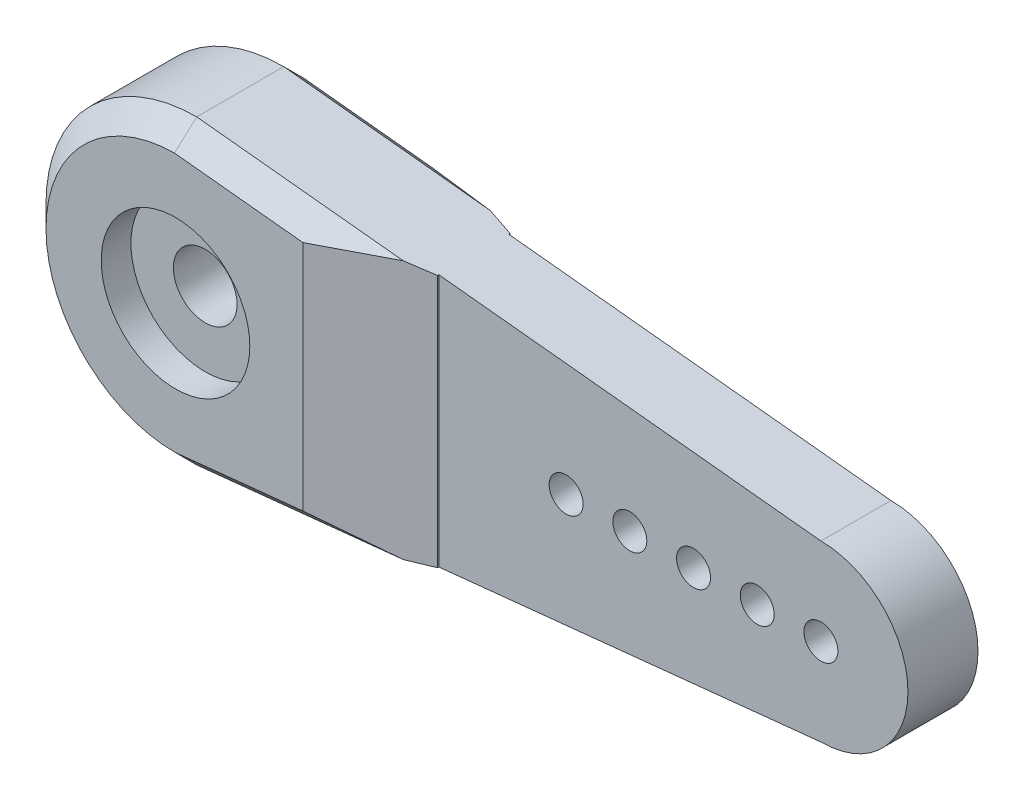
ISO-10303-21;
HEADER;
FILE_DESCRIPTION(('STEP AP214'),'2;1');
FILE_NAME('part.step','',(''),(''),'','','');
FILE_SCHEMA(('AUTOMOTIVE_DESIGN { 1 0 10303 214 1 1 1 1 }'));
ENDSEC;
DATA;
#1=APPLICATION_CONTEXT('core data for automotive mechanical design processes');
#2=APPLICATION_PROTOCOL_DEFINITION('international standard','automotive_design',2000,#1);
#3=PRODUCT_CONTEXT('',#1,'mechanical');
#4=PRODUCT('Part','Part','',(#3));
#5=PRODUCT_RELATED_PRODUCT_CATEGORY('part','',(#4));
#6=PRODUCT_DEFINITION_FORMATION('','',#4);
#7=PRODUCT_DEFINITION_CONTEXT('part definition',#1,'design');
#8=PRODUCT_DEFINITION('design','',#6,#7);
#9=PRODUCT_DEFINITION_SHAPE('','',#8);
#10=(LENGTH_UNIT() NAMED_UNIT(*) SI_UNIT(.MILLI.,.METRE.));
#11=(NAMED_UNIT(*) PLANE_ANGLE_UNIT() SI_UNIT($,.RADIAN.));
#12=(NAMED_UNIT(*) SI_UNIT($,.STERADIAN.) SOLID_ANGLE_UNIT());
#13=UNCERTAINTY_MEASURE_WITH_UNIT(LENGTH_MEASURE(1.E-05),#10,'distance_accuracy_value','');
#14=(GEOMETRIC_REPRESENTATION_CONTEXT(3) GLOBAL_UNCERTAINTY_ASSIGNED_CONTEXT((#13)) GLOBAL_UNIT_ASSIGNED_CONTEXT((#10,
#11,#12)) REPRESENTATION_CONTEXT('',''));
#15=CARTESIAN_POINT('',(0.,0.,0.));
#16=DIRECTION('',(0.,0.,1.));
#17=DIRECTION('',(1.,0.,0.));
#18=AXIS2_PLACEMENT_3D('',#15,#16,#17);
#19=CARTESIAN_POINT('',(0.,0.,3.3));
#20=DIRECTION('',(0.,0.,1.));
#21=DIRECTION('',(1.,0.,0.));
#22=AXIS2_PLACEMENT_3D('',#19,#20,#21);
#23=PLANE('',#22);
#24=DIRECTION('',(0.,1.,0.));
#25=VECTOR('',#24,1.);
#26=CARTESIAN_POINT('',(11.,0.,3.3));
#27=LINE('',#26,#25);
#28=CARTESIAN_POINT('',(11.,-5.96206896551724,3.3));
#29=VERTEX_POINT('',#28);
#30=CARTESIAN_POINT('',(11.,5.96206896551724,3.3));
#31=VERTEX_POINT('',#30);
#32=EDGE_CURVE('E162',#29,#31,#27,.T.);
#33=ORIENTED_EDGE('',*,*,#32,.F.);
#34=DIRECTION('',(0.994691793826551,0.102899151085505,0.));
#35=VECTOR('',#34,1.);
#36=CARTESIAN_POINT('',(0.,-7.1,3.3));
#37=LINE('',#36,#35);
#38=CARTESIAN_POINT('',(29.,-4.1,3.3));
#39=VERTEX_POINT('',#38);
#40=EDGE_CURVE('E169',#29,#39,#37,.T.);
#41=ORIENTED_EDGE('',*,*,#40,.T.);
#42=CARTESIAN_POINT('',(29.,0.,3.3));
#43=DIRECTION('',(0.,0.,1.));
#44=DIRECTION('',(-1.,0.,0.));
#45=AXIS2_PLACEMENT_3D('',#42,#43,#44);
#46=CIRCLE('',#45,4.1);
#47=CARTESIAN_POINT('',(29.,4.1,3.3));
#48=VERTEX_POINT('',#47);
#49=EDGE_CURVE('E172',#39,#48,#46,.T.);
#50=ORIENTED_EDGE('',*,*,#49,.T.);
#51=DIRECTION('',(-0.994691793826551,0.102899151085505,0.));
#52=VECTOR('',#51,1.);
#53=CARTESIAN_POINT('',(29.,4.1,3.3));
#54=LINE('',#53,#52);
#55=EDGE_CURVE('E180',#48,#31,#54,.T.);
#56=ORIENTED_EDGE('',*,*,#55,.T.);
#57=EDGE_LOOP('',(#33,#41,#50,#56));
#58=FACE_BOUND('',#57,.T.);
#59=CARTESIAN_POINT('',(20.,0.,3.3));
#60=DIRECTION('',(0.,0.,1.));
#61=DIRECTION('',(1.,0.,0.));
#62=AXIS2_PLACEMENT_3D('',#59,#60,#61);
#63=CIRCLE('',#62,0.799999999999999);
#64=CARTESIAN_POINT('',(20.8,0.,3.3));
#65=VERTEX_POINT('',#64);
#66=EDGE_CURVE('E369',#65,#65,#63,.T.);
#67=ORIENTED_EDGE('',*,*,#66,.F.);
#68=EDGE_LOOP('',(#67));
#69=FACE_BOUND('',#68,.T.);
#70=CARTESIAN_POINT('',(26.,0.,3.3));
#71=DIRECTION('',(0.,0.,1.));
#72=DIRECTION('',(1.,0.,0.));
#73=AXIS2_PLACEMENT_3D('',#70,#71,#72);
#74=CIRCLE('',#73,0.799999999999999);
#75=CARTESIAN_POINT('',(26.8,0.,3.3));
#76=VERTEX_POINT('',#75);
#77=EDGE_CURVE('E381',#76,#76,#74,.T.);
#78=ORIENTED_EDGE('',*,*,#77,.F.);
#79=EDGE_LOOP('',(#78));
#80=FACE_BOUND('',#79,.T.);
#81=CARTESIAN_POINT('',(29.,0.,3.3));
#82=DIRECTION('',(0.,0.,1.));
#83=DIRECTION('',(1.,0.,0.));
#84=AXIS2_PLACEMENT_3D('',#81,#82,#83);
#85=CIRCLE('',#84,0.799999999999999);
#86=CARTESIAN_POINT('',(29.8,0.,3.3));
#87=VERTEX_POINT('',#86);
#88=EDGE_CURVE('E391',#87,#87,#85,.T.);
#89=ORIENTED_EDGE('',*,*,#88,.F.);
#90=EDGE_LOOP('',(#89));
#91=FACE_BOUND('',#90,.T.);
#92=CARTESIAN_POINT('',(23.,0.,3.3));
#93=DIRECTION('',(0.,0.,1.));
#94=DIRECTION('',(1.,0.,0.));
#95=AXIS2_PLACEMENT_3D('',#92,#93,#94);
#96=CIRCLE('',#95,0.800000000000002);
#97=CARTESIAN_POINT('',(23.8,0.,3.3));
#98=VERTEX_POINT('',#97);
#99=EDGE_CURVE('E375',#98,#98,#96,.T.);
#100=ORIENTED_EDGE('',*,*,#99,.F.);
#101=EDGE_LOOP('',(#100));
#102=FACE_BOUND('',#101,.T.);
#103=CARTESIAN_POINT('',(17.,0.,3.3));
#104=DIRECTION('',(0.,0.,1.));
#105=DIRECTION('',(1.,0.,0.));
#106=AXIS2_PLACEMENT_3D('',#103,#104,#105);
#107=CIRCLE('',#106,0.799999999999999);
#108=CARTESIAN_POINT('',(17.8,0.,3.3));
#109=VERTEX_POINT('',#108);
#110=EDGE_CURVE('E361',#109,#109,#107,.T.);
#111=ORIENTED_EDGE('',*,*,#110,.F.);
#112=EDGE_LOOP('',(#111));
#113=FACE_BOUND('',#112,.T.);
#114=ADVANCED_FACE('F33',(#58,#69,#80,#91,#102,#113),#23,.T.);
#115=CARTESIAN_POINT('',(0.,0.,0.));
#116=DIRECTION('',(0.,0.,1.));
#117=DIRECTION('',(1.,0.,0.));
#118=AXIS2_PLACEMENT_3D('',#115,#116,#117);
#119=PLANE('',#118);
#120=DIRECTION('',(0.994691793826551,0.102899151085505,0.));
#121=VECTOR('',#120,1.);
#122=CARTESIAN_POINT('',(0.,-7.1,0.));
#123=LINE('',#122,#121);
#124=CARTESIAN_POINT('',(11.,-5.96206896551724,0.));
#125=VERTEX_POINT('',#124);
#126=CARTESIAN_POINT('',(29.,-4.1,0.));
#127=VERTEX_POINT('',#126);
#128=EDGE_CURVE('E161',#125,#127,#123,.T.);
#129=ORIENTED_EDGE('',*,*,#128,.F.);
#130=DIRECTION('',(0.,1.,0.));
#131=VECTOR('',#130,1.);
#132=CARTESIAN_POINT('',(11.,0.,0.));
#133=LINE('',#132,#131);
#134=CARTESIAN_POINT('',(11.,5.96206896551724,0.));
#135=VERTEX_POINT('',#134);
#136=EDGE_CURVE('E146',#125,#135,#133,.T.);
#137=ORIENTED_EDGE('',*,*,#136,.T.);
#138=DIRECTION('',(-0.994691793826551,0.102899151085505,0.));
#139=VECTOR('',#138,1.);
#140=CARTESIAN_POINT('',(29.,4.1,0.));
#141=LINE('',#140,#139);
#142=CARTESIAN_POINT('',(29.,4.1,0.));
#143=VERTEX_POINT('',#142);
#144=EDGE_CURVE('E160',#143,#135,#141,.T.);
#145=ORIENTED_EDGE('',*,*,#144,.F.);
#146=CARTESIAN_POINT('',(29.,0.,0.));
#147=DIRECTION('',(0.,0.,1.));
#148=DIRECTION('',(-1.,0.,0.));
#149=AXIS2_PLACEMENT_3D('',#146,#147,#148);
#150=CIRCLE('',#149,4.1);
#151=EDGE_CURVE('E170',#127,#143,#150,.T.);
#152=ORIENTED_EDGE('',*,*,#151,.F.);
#153=EDGE_LOOP('',(#129,#137,#145,#152));
#154=FACE_BOUND('',#153,.T.);
#155=CARTESIAN_POINT('',(29.,0.,0.));
#156=DIRECTION('',(0.,0.,1.));
#157=DIRECTION('',(1.,0.,0.));
#158=AXIS2_PLACEMENT_3D('',#155,#156,#157);
#159=CIRCLE('',#158,0.799999999999999);
#160=CARTESIAN_POINT('',(29.8,0.,0.));
#161=VERTEX_POINT('',#160);
#162=EDGE_CURVE('E388',#161,#161,#159,.T.);
#163=ORIENTED_EDGE('',*,*,#162,.T.);
#164=EDGE_LOOP('',(#163));
#165=FACE_BOUND('',#164,.T.);
#166=CARTESIAN_POINT('',(26.,0.,0.));
#167=DIRECTION('',(0.,0.,1.));
#168=DIRECTION('',(1.,0.,0.));
#169=AXIS2_PLACEMENT_3D('',#166,#167,#168);
#170=CIRCLE('',#169,0.799999999999999);
#171=CARTESIAN_POINT('',(26.8,0.,0.));
#172=VERTEX_POINT('',#171);
#173=EDGE_CURVE('E378',#172,#172,#170,.T.);
#174=ORIENTED_EDGE('',*,*,#173,.T.);
#175=EDGE_LOOP('',(#174));
#176=FACE_BOUND('',#175,.T.);
#177=CARTESIAN_POINT('',(23.,0.,0.));
#178=DIRECTION('',(0.,0.,1.));
#179=DIRECTION('',(1.,0.,0.));
#180=AXIS2_PLACEMENT_3D('',#177,#178,#179);
#181=CIRCLE('',#180,0.800000000000002);
#182=CARTESIAN_POINT('',(23.8,0.,0.));
#183=VERTEX_POINT('',#182);
#184=EDGE_CURVE('E372',#183,#183,#181,.T.);
#185=ORIENTED_EDGE('',*,*,#184,.T.);
#186=EDGE_LOOP('',(#185));
#187=FACE_BOUND('',#186,.T.);
#188=CARTESIAN_POINT('',(20.,0.,0.));
#189=DIRECTION('',(0.,0.,1.));
#190=DIRECTION('',(1.,0.,0.));
#191=AXIS2_PLACEMENT_3D('',#188,#189,#190);
#192=CIRCLE('',#191,0.799999999999999);
#193=CARTESIAN_POINT('',(20.8,0.,0.));
#194=VERTEX_POINT('',#193);
#195=EDGE_CURVE('E367',#194,#194,#192,.T.);
#196=ORIENTED_EDGE('',*,*,#195,.T.);
#197=EDGE_LOOP('',(#196));
#198=FACE_BOUND('',#197,.T.);
#199=CARTESIAN_POINT('',(17.,0.,0.));
#200=DIRECTION('',(0.,0.,1.));
#201=DIRECTION('',(1.,0.,0.));
#202=AXIS2_PLACEMENT_3D('',#199,#200,#201);
#203=CIRCLE('',#202,0.799999999999999);
#204=CARTESIAN_POINT('',(17.8,0.,0.));
#205=VERTEX_POINT('',#204);
#206=EDGE_CURVE('E358',#205,#205,#203,.T.);
#207=ORIENTED_EDGE('',*,*,#206,.T.);
#208=EDGE_LOOP('',(#207));
#209=FACE_BOUND('',#208,.T.);
#210=ADVANCED_FACE('F157',(#154,#165,#176,#187,#198,#209),#119,.F.);
#211=CARTESIAN_POINT('',(0.,0.,3.3));
#212=DIRECTION('',(0.,0.,-1.));
#213=DIRECTION('',(-1.,0.,0.));
#214=AXIS2_PLACEMENT_3D('',#211,#212,#213);
#215=CYLINDRICAL_SURFACE('',#214,7.1);
#216=DIRECTION('',(0.,0.,-1.));
#217=VECTOR('',#216,1.);
#218=CARTESIAN_POINT('',(0.,7.1,3.3));
#219=LINE('',#218,#217);
#220=CARTESIAN_POINT('',(0.,7.1,3.69999999999999));
#221=VERTEX_POINT('',#220);
#222=CARTESIAN_POINT('',(0.,7.1,-0.399999999999999));
#223=VERTEX_POINT('',#222);
#224=EDGE_CURVE('E177',#221,#223,#219,.T.);
#225=ORIENTED_EDGE('',*,*,#224,.T.);
#226=CARTESIAN_POINT('',(0.,0.,-0.399999999999998));
#227=DIRECTION('',(0.,0.,1.));
#228=DIRECTION('',(1.,0.,0.));
#229=AXIS2_PLACEMENT_3D('',#226,#227,#228);
#230=CIRCLE('',#229,7.1);
#231=CARTESIAN_POINT('',(0.,-7.1,-0.399999999999998));
#232=VERTEX_POINT('',#231);
#233=EDGE_CURVE('E291',#223,#232,#230,.T.);
#234=ORIENTED_EDGE('',*,*,#233,.T.);
#235=DIRECTION('',(0.,0.,-1.));
#236=VECTOR('',#235,1.);
#237=CARTESIAN_POINT('',(0.,-7.1,3.3));
#238=LINE('',#237,#236);
#239=CARTESIAN_POINT('',(0.,-7.1,3.69999999999999));
#240=VERTEX_POINT('',#239);
#241=EDGE_CURVE('E185',#240,#232,#238,.T.);
#242=ORIENTED_EDGE('',*,*,#241,.F.);
#243=CARTESIAN_POINT('',(0.,0.,3.69999999999999));
#244=DIRECTION('',(0.,0.,1.));
#245=DIRECTION('',(1.,0.,0.));
#246=AXIS2_PLACEMENT_3D('',#243,#244,#245);
#247=CIRCLE('',#246,7.1);
#248=EDGE_CURVE('E206',#240,#221,#247,.F.);
#249=ORIENTED_EDGE('',*,*,#248,.T.);
#250=EDGE_LOOP('',(#225,#234,#242,#249));
#251=FACE_BOUND('',#250,.T.);
#252=ADVANCED_FACE('F330',(#251),#215,.T.);
#253=CARTESIAN_POINT('',(0.,-7.1,3.3));
#254=DIRECTION('',(-0.102899151085505,0.994691793826551,0.));
#255=DIRECTION('',(-0.994691793826551,-0.102899151085505,0.));
#256=AXIS2_PLACEMENT_3D('',#253,#254,#255);
#257=PLANE('',#256);
#258=ORIENTED_EDGE('',*,*,#241,.T.);
#259=DIRECTION('',(0.994691793826551,0.102899151085505,0.));
#260=VECTOR('',#259,1.);
#261=CARTESIAN_POINT('',(0.,-7.1,-0.399999999999998));
#262=LINE('',#261,#260);
#263=CARTESIAN_POINT('',(9.73205080756886,-6.09323612335494,-0.399999999999999));
#264=VERTEX_POINT('',#263);
#265=EDGE_CURVE('E210',#232,#264,#262,.T.);
#266=ORIENTED_EDGE('',*,*,#265,.T.);
#267=DIRECTION('',(0.961139410487415,0.0994282148780084,0.257536528853825));
#268=VECTOR('',#267,1.);
#269=CARTESIAN_POINT('',(11.,-5.96206896551724,-0.0602540378443856));
#270=LINE('',#269,#268);
#271=CARTESIAN_POINT('',(11.,-5.96206896551724,-0.0602540378443861));
#272=VERTEX_POINT('',#271);
#273=EDGE_CURVE('E197',#264,#272,#270,.T.);
#274=ORIENTED_EDGE('',*,*,#273,.T.);
#275=DIRECTION('',(0.,0.,1.));
#276=VECTOR('',#275,1.);
#277=CARTESIAN_POINT('',(11.,-5.96206896551724,-1.4));
#278=LINE('',#277,#276);
#279=EDGE_CURVE('E401',#272,#125,#278,.T.);
#280=ORIENTED_EDGE('',*,*,#279,.T.);
#281=ORIENTED_EDGE('',*,*,#128,.T.);
#282=DIRECTION('',(0.,0.,-1.));
#283=VECTOR('',#282,1.);
#284=CARTESIAN_POINT('',(29.,-4.1,3.3));
#285=LINE('',#284,#283);
#286=EDGE_CURVE('E182',#39,#127,#285,.T.);
#287=ORIENTED_EDGE('',*,*,#286,.F.);
#288=ORIENTED_EDGE('',*,*,#40,.F.);
#289=CARTESIAN_POINT('',(11.,-5.96206896551724,3.36025403784438));
#290=VERTEX_POINT('',#289);
#291=EDGE_CURVE('E406',#29,#290,#278,.T.);
#292=ORIENTED_EDGE('',*,*,#291,.T.);
#293=DIRECTION('',(0.961139410487415,0.0994282148780084,-0.257536528853825));
#294=VECTOR('',#293,1.);
#295=CARTESIAN_POINT('',(6.619191248936,-6.41525607769628,4.53408820488717));
#296=LINE('',#295,#294);
#297=CARTESIAN_POINT('',(9.73205080756889,-6.09323612335494,3.69999999999999));
#298=VERTEX_POINT('',#297);
#299=EDGE_CURVE('E199',#290,#298,#296,.F.);
#300=ORIENTED_EDGE('',*,*,#299,.T.);
#301=DIRECTION('',(-0.994691793826551,-0.102899151085505,0.));
#302=VECTOR('',#301,1.);
#303=CARTESIAN_POINT('',(1.45341176470589,-6.94964705882353,3.69999999999999));
#304=LINE('',#303,#302);
#305=EDGE_CURVE('E288',#298,#240,#304,.T.);
#306=ORIENTED_EDGE('',*,*,#305,.T.);
#307=EDGE_LOOP('',(#258,#266,#274,#280,#281,#287,#288,#292,#300,#306));
#308=FACE_BOUND('',#307,.T.);
#309=ADVANCED_FACE('F399',(#308),#257,.F.);
#310=CARTESIAN_POINT('',(29.,0.,3.3));
#311=DIRECTION('',(0.,0.,-1.));
#312=DIRECTION('',(-1.,0.,0.));
#313=AXIS2_PLACEMENT_3D('',#310,#311,#312);
#314=CYLINDRICAL_SURFACE('',#313,4.1);
#315=ORIENTED_EDGE('',*,*,#151,.T.);
#316=DIRECTION('',(0.,0.,-1.));
#317=VECTOR('',#316,1.);
#318=CARTESIAN_POINT('',(29.,4.1,3.3));
#319=LINE('',#318,#317);
#320=EDGE_CURVE('E168',#48,#143,#319,.T.);
#321=ORIENTED_EDGE('',*,*,#320,.F.);
#322=ORIENTED_EDGE('',*,*,#49,.F.);
#323=ORIENTED_EDGE('',*,*,#286,.T.);
#324=EDGE_LOOP('',(#315,#321,#322,#323));
#325=FACE_BOUND('',#324,.T.);
#326=ADVANCED_FACE('F403',(#325),#314,.T.);
#327=CARTESIAN_POINT('',(29.,4.1,3.3));
#328=DIRECTION('',(-0.102899151085505,-0.994691793826551,0.));
#329=DIRECTION('',(0.994691793826551,-0.102899151085505,0.));
#330=AXIS2_PLACEMENT_3D('',#327,#328,#329);
#331=PLANE('',#330);
#332=DIRECTION('',(-0.961139410487415,0.0994282148780084,-0.257536528853825));
#333=VECTOR('',#332,1.);
#334=CARTESIAN_POINT('',(12.1395227987338,5.84418729668271,0.245080175833196));
#335=LINE('',#334,#333);
#336=CARTESIAN_POINT('',(11.,5.96206896551724,-0.0602540378443861));
#337=VERTEX_POINT('',#336);
#338=CARTESIAN_POINT('',(9.73205080756886,6.09323612335494,-0.399999999999999));
#339=VERTEX_POINT('',#338);
#340=EDGE_CURVE('E191',#337,#339,#335,.T.);
#341=ORIENTED_EDGE('',*,*,#340,.T.);
#342=DIRECTION('',(-0.994691793826551,0.102899151085505,0.));
#343=VECTOR('',#342,1.);
#344=CARTESIAN_POINT('',(29.,4.1,-0.399999999999999));
#345=LINE('',#344,#343);
#346=EDGE_CURVE('E217',#339,#223,#345,.T.);
#347=ORIENTED_EDGE('',*,*,#346,.T.);
#348=ORIENTED_EDGE('',*,*,#224,.F.);
#349=DIRECTION('',(0.994691793826551,-0.102899151085505,0.));
#350=VECTOR('',#349,1.);
#351=CARTESIAN_POINT('',(5.99999999999994,6.47931034482759,3.69999999999999));
#352=LINE('',#351,#350);
#353=CARTESIAN_POINT('',(9.73205080756889,6.09323612335494,3.69999999999999));
#354=VERTEX_POINT('',#353);
#355=EDGE_CURVE('E215',#221,#354,#352,.T.);
#356=ORIENTED_EDGE('',*,*,#355,.T.);
#357=DIRECTION('',(-0.961139410487415,0.0994282148780084,0.257536528853825));
#358=VECTOR('',#357,1.);
#359=CARTESIAN_POINT('',(6.619191248936,6.41525607769628,4.53408820488717));
#360=LINE('',#359,#358);
#361=CARTESIAN_POINT('',(11.,5.96206896551724,3.36025403784438));
#362=VERTEX_POINT('',#361);
#363=EDGE_CURVE('E193',#354,#362,#360,.F.);
#364=ORIENTED_EDGE('',*,*,#363,.T.);
#365=DIRECTION('',(0.,0.,1.));
#366=VECTOR('',#365,1.);
#367=CARTESIAN_POINT('',(11.,5.96206896551724,-1.4));
#368=LINE('',#367,#366);
#369=EDGE_CURVE('E153',#31,#362,#368,.T.);
#370=ORIENTED_EDGE('',*,*,#369,.F.);
#371=ORIENTED_EDGE('',*,*,#55,.F.);
#372=ORIENTED_EDGE('',*,*,#320,.T.);
#373=ORIENTED_EDGE('',*,*,#144,.T.);
#374=EDGE_CURVE('E142',#337,#135,#368,.T.);
#375=ORIENTED_EDGE('',*,*,#374,.F.);
#376=EDGE_LOOP('',(#341,#347,#348,#356,#364,#370,#371,#372,#373,#375));
#377=FACE_BOUND('',#376,.T.);
#378=ADVANCED_FACE('F165',(#377),#331,.F.);
#379=CARTESIAN_POINT('',(29.,0.,3.3));
#380=DIRECTION('',(0.,0.,-1.));
#381=DIRECTION('',(-1.,0.,0.));
#382=AXIS2_PLACEMENT_3D('',#379,#380,#381);
#383=CYLINDRICAL_SURFACE('',#382,0.799999999999999);
#384=ORIENTED_EDGE('',*,*,#88,.T.);
#385=EDGE_LOOP('',(#384));
#386=FACE_BOUND('',#385,.T.);
#387=ORIENTED_EDGE('',*,*,#162,.F.);
#388=EDGE_LOOP('',(#387));
#389=FACE_BOUND('',#388,.T.);
#390=ADVANCED_FACE('F475',(#386,#389),#383,.F.);
#391=CARTESIAN_POINT('',(26.,0.,3.3));
#392=DIRECTION('',(0.,0.,-1.));
#393=DIRECTION('',(-1.,0.,0.));
#394=AXIS2_PLACEMENT_3D('',#391,#392,#393);
#395=CYLINDRICAL_SURFACE('',#394,0.799999999999999);
#396=ORIENTED_EDGE('',*,*,#77,.T.);
#397=EDGE_LOOP('',(#396));
#398=FACE_BOUND('',#397,.T.);
#399=ORIENTED_EDGE('',*,*,#173,.F.);
#400=EDGE_LOOP('',(#399));
#401=FACE_BOUND('',#400,.T.);
#402=ADVANCED_FACE('F472',(#398,#401),#395,.F.);
#403=CARTESIAN_POINT('',(23.,0.,3.3));
#404=DIRECTION('',(0.,0.,-1.));
#405=DIRECTION('',(-1.,0.,0.));
#406=AXIS2_PLACEMENT_3D('',#403,#404,#405);
#407=CYLINDRICAL_SURFACE('',#406,0.800000000000002);
#408=ORIENTED_EDGE('',*,*,#99,.T.);
#409=EDGE_LOOP('',(#408));
#410=FACE_BOUND('',#409,.T.);
#411=ORIENTED_EDGE('',*,*,#184,.F.);
#412=EDGE_LOOP('',(#411));
#413=FACE_BOUND('',#412,.T.);
#414=ADVANCED_FACE('F465',(#410,#413),#407,.F.);
#415=CARTESIAN_POINT('',(20.,0.,3.3));
#416=DIRECTION('',(0.,0.,-1.));
#417=DIRECTION('',(-1.,0.,0.));
#418=AXIS2_PLACEMENT_3D('',#415,#416,#417);
#419=CYLINDRICAL_SURFACE('',#418,0.799999999999999);
#420=ORIENTED_EDGE('',*,*,#66,.T.);
#421=EDGE_LOOP('',(#420));
#422=FACE_BOUND('',#421,.T.);
#423=ORIENTED_EDGE('',*,*,#195,.F.);
#424=EDGE_LOOP('',(#423));
#425=FACE_BOUND('',#424,.T.);
#426=ADVANCED_FACE('F460',(#422,#425),#419,.F.);
#427=CARTESIAN_POINT('',(17.,0.,3.3));
#428=DIRECTION('',(0.,0.,-1.));
#429=DIRECTION('',(-1.,0.,0.));
#430=AXIS2_PLACEMENT_3D('',#427,#428,#429);
#431=CYLINDRICAL_SURFACE('',#430,0.799999999999999);
#432=ORIENTED_EDGE('',*,*,#110,.T.);
#433=EDGE_LOOP('',(#432));
#434=FACE_BOUND('',#433,.T.);
#435=ORIENTED_EDGE('',*,*,#206,.F.);
#436=EDGE_LOOP('',(#435));
#437=FACE_BOUND('',#436,.T.);
#438=ADVANCED_FACE('F454',(#434,#437),#431,.F.);
#439=CARTESIAN_POINT('',(11.,-5.96206896551724,-1.4));
#440=DIRECTION('',(1.,0.,0.));
#441=DIRECTION('',(0.,0.,-1.));
#442=AXIS2_PLACEMENT_3D('',#439,#440,#441);
#443=PLANE('',#442);
#444=ORIENTED_EDGE('',*,*,#279,.F.);
#445=DIRECTION('',(0.,1.,0.));
#446=VECTOR('',#445,1.);
#447=CARTESIAN_POINT('',(11.,5.96206896551724,-0.0602540378443856));
#448=LINE('',#447,#446);
#449=EDGE_CURVE('E149',#272,#337,#448,.T.);
#450=ORIENTED_EDGE('',*,*,#449,.T.);
#451=ORIENTED_EDGE('',*,*,#374,.T.);
#452=ORIENTED_EDGE('',*,*,#136,.F.);
#453=EDGE_LOOP('',(#444,#450,#451,#452));
#454=FACE_BOUND('',#453,.T.);
#455=ADVANCED_FACE('F145',(#454),#443,.T.);
#456=CARTESIAN_POINT('',(0.,0.,-1.4));
#457=DIRECTION('',(0.,0.,1.));
#458=DIRECTION('',(1.,0.,0.));
#459=AXIS2_PLACEMENT_3D('',#456,#457,#458);
#460=PLANE('',#459);
#461=CARTESIAN_POINT('',(0.,0.,-1.4));
#462=DIRECTION('',(0.,0.,1.));
#463=DIRECTION('',(1.,0.,0.));
#464=AXIS2_PLACEMENT_3D('',#461,#462,#463);
#465=CIRCLE('',#464,3.5);
#466=CARTESIAN_POINT('',(3.5,0.,-1.4));
#467=VERTEX_POINT('',#466);
#468=EDGE_CURVE('E410',#467,#467,#465,.T.);
#469=ORIENTED_EDGE('',*,*,#468,.T.);
#470=EDGE_LOOP('',(#469));
#471=FACE_BOUND('',#470,.T.);
#472=DIRECTION('',(-0.994691793826551,-0.102899151085505,0.));
#473=VECTOR('',#472,1.);
#474=CARTESIAN_POINT('',(0.623806731267436,-6.03013173558521,-1.4));
#475=LINE('',#474,#473);
#476=CARTESIAN_POINT('',(5.99999999999994,-5.47397381123357,-1.4));
#477=VERTEX_POINT('',#476);
#478=CARTESIAN_POINT('',(0.,-6.1,-1.4));
#479=VERTEX_POINT('',#478);
#480=EDGE_CURVE('E218',#477,#479,#475,.T.);
#481=ORIENTED_EDGE('',*,*,#480,.T.);
#482=CARTESIAN_POINT('',(0.,0.,-1.4));
#483=DIRECTION('',(0.,0.,1.));
#484=DIRECTION('',(1.,0.,0.));
#485=AXIS2_PLACEMENT_3D('',#482,#483,#484);
#486=CIRCLE('',#485,6.1);
#487=CARTESIAN_POINT('',(-0.0496344437445385,6.09979806403473,-1.4));
#488=VERTEX_POINT('',#487);
#489=EDGE_CURVE('E214',#479,#488,#486,.F.);
#490=ORIENTED_EDGE('',*,*,#489,.T.);
#491=DIRECTION('',(0.994691793826551,-0.102899151085505,0.));
#492=VECTOR('',#491,1.);
#493=CARTESIAN_POINT('',(0.623806731267436,6.03013173558521,-1.4));
#494=LINE('',#493,#492);
#495=CARTESIAN_POINT('',(5.99999999999994,5.47397381123357,-1.4));
#496=VERTEX_POINT('',#495);
#497=EDGE_CURVE('E212',#488,#496,#494,.T.);
#498=ORIENTED_EDGE('',*,*,#497,.T.);
#499=DIRECTION('',(0.,-1.,0.));
#500=VECTOR('',#499,1.);
#501=CARTESIAN_POINT('',(5.99999999999994,-5.96206896551724,-1.4));
#502=LINE('',#501,#500);
#503=EDGE_CURVE('E203',#496,#477,#502,.T.);
#504=ORIENTED_EDGE('',*,*,#503,.T.);
#505=EDGE_LOOP('',(#481,#490,#498,#504));
#506=FACE_BOUND('',#505,.T.);
#507=ADVANCED_FACE('F346',(#471,#506),#460,.F.);
#508=CARTESIAN_POINT('',(0.,0.,-1.4));
#509=DIRECTION('',(0.,0.,1.));
#510=DIRECTION('',(1.,0.,0.));
#511=AXIS2_PLACEMENT_3D('',#508,#509,#510);
#512=CYLINDRICAL_SURFACE('',#511,3.5);
#513=CARTESIAN_POINT('',(0.,0.,0.));
#514=DIRECTION('',(0.,0.,1.));
#515=DIRECTION('',(1.,0.,0.));
#516=AXIS2_PLACEMENT_3D('',#513,#514,#515);
#517=CIRCLE('',#516,3.5);
#518=CARTESIAN_POINT('',(3.5,0.,0.));
#519=VERTEX_POINT('',#518);
#520=EDGE_CURVE('E186',#519,#519,#517,.T.);
#521=CARTESIAN_POINT('',(3.5,0.,-1.4));
#522=CARTESIAN_POINT('',(3.5,0.,-1.38541666666667));
#523=CARTESIAN_POINT('',(3.5,0.,-1.37083333333333));
#524=CARTESIAN_POINT('',(3.5,0.,-1.34166666666667));
#525=CARTESIAN_POINT('',(3.5,0.,-1.32708333333333));
#526=CARTESIAN_POINT('',(3.5,0.,-1.29791666666667));
#527=CARTESIAN_POINT('',(3.5,0.,-1.28333333333333));
#528=CARTESIAN_POINT('',(3.5,0.,-1.25416666666667));
#529=CARTESIAN_POINT('',(3.5,0.,-1.23958333333333));
#530=CARTESIAN_POINT('',(3.5,0.,-1.21041666666667));
#531=CARTESIAN_POINT('',(3.5,0.,-1.19583333333333));
#532=CARTESIAN_POINT('',(3.5,0.,-1.16666666666667));
#533=CARTESIAN_POINT('',(3.5,0.,-1.15208333333333));
#534=CARTESIAN_POINT('',(3.5,0.,-1.12291666666667));
#535=CARTESIAN_POINT('',(3.5,0.,-1.10833333333333));
#536=CARTESIAN_POINT('',(3.5,0.,-1.07916666666667));
#537=CARTESIAN_POINT('',(3.5,0.,-1.06458333333333));
#538=CARTESIAN_POINT('',(3.5,0.,-1.03541666666667));
#539=CARTESIAN_POINT('',(3.5,0.,-1.02083333333333));
#540=CARTESIAN_POINT('',(3.5,0.,-0.991666666666666));
#541=CARTESIAN_POINT('',(3.5,0.,-0.977083333333333));
#542=CARTESIAN_POINT('',(3.5,0.,-0.947916666666666));
#543=CARTESIAN_POINT('',(3.5,0.,-0.933333333333333));
#544=CARTESIAN_POINT('',(3.5,0.,-0.904166666666666));
#545=CARTESIAN_POINT('',(3.5,0.,-0.889583333333333));
#546=CARTESIAN_POINT('',(3.5,0.,-0.860416666666666));
#547=CARTESIAN_POINT('',(3.5,0.,-0.845833333333333));
#548=CARTESIAN_POINT('',(3.5,0.,-0.816666666666667));
#549=CARTESIAN_POINT('',(3.5,0.,-0.802083333333333));
#550=CARTESIAN_POINT('',(3.5,0.,-0.772916666666666));
#551=CARTESIAN_POINT('',(3.5,0.,-0.758333333333333));
#552=CARTESIAN_POINT('',(3.5,0.,-0.729166666666667));
#553=CARTESIAN_POINT('',(3.5,0.,-0.714583333333333));
#554=CARTESIAN_POINT('',(3.5,0.,-0.685416666666667));
#555=CARTESIAN_POINT('',(3.5,0.,-0.670833333333333));
#556=CARTESIAN_POINT('',(3.5,0.,-0.641666666666667));
#557=CARTESIAN_POINT('',(3.5,0.,-0.627083333333333));
#558=CARTESIAN_POINT('',(3.5,0.,-0.597916666666667));
#559=CARTESIAN_POINT('',(3.5,0.,-0.583333333333333));
#560=CARTESIAN_POINT('',(3.5,0.,-0.554166666666667));
#561=CARTESIAN_POINT('',(3.5,0.,-0.539583333333333));
#562=CARTESIAN_POINT('',(3.5,0.,-0.510416666666667));
#563=CARTESIAN_POINT('',(3.5,0.,-0.495833333333333));
#564=CARTESIAN_POINT('',(3.5,0.,-0.466666666666667));
#565=CARTESIAN_POINT('',(3.5,0.,-0.452083333333333));
#566=CARTESIAN_POINT('',(3.5,0.,-0.422916666666667));
#567=CARTESIAN_POINT('',(3.5,0.,-0.408333333333333));
#568=CARTESIAN_POINT('',(3.5,0.,-0.379166666666667));
#569=CARTESIAN_POINT('',(3.5,0.,-0.364583333333333));
#570=CARTESIAN_POINT('',(3.5,0.,-0.335416666666667));
#571=CARTESIAN_POINT('',(3.5,0.,-0.320833333333333));
#572=CARTESIAN_POINT('',(3.5,0.,-0.291666666666667));
#573=CARTESIAN_POINT('',(3.5,0.,-0.277083333333333));
#574=CARTESIAN_POINT('',(3.5,0.,-0.247916666666667));
#575=CARTESIAN_POINT('',(3.5,0.,-0.233333333333334));
#576=CARTESIAN_POINT('',(3.5,0.,-0.204166666666667));
#577=CARTESIAN_POINT('',(3.5,0.,-0.189583333333333));
#578=CARTESIAN_POINT('',(3.5,0.,-0.160416666666667));
#579=CARTESIAN_POINT('',(3.5,0.,-0.145833333333333));
#580=CARTESIAN_POINT('',(3.5,0.,-0.116666666666667));
#581=CARTESIAN_POINT('',(3.5,0.,-0.102083333333333));
#582=CARTESIAN_POINT('',(3.5,0.,-0.0729166666666668));
#583=CARTESIAN_POINT('',(3.5,0.,-0.0583333333333335));
#584=CARTESIAN_POINT('',(3.5,0.,-0.0291666666666669));
#585=CARTESIAN_POINT('',(3.5,0.,-0.0145833333333335));
#586=CARTESIAN_POINT('',(3.5,0.,0.));
#587=B_SPLINE_CURVE_WITH_KNOTS('',3,(#521,#522,#523,#524,#525,#526,#527,#528,#529,#530,#531,
#532,#533,#534,#535,#536,#537,#538,#539,#540,#541,#542,#543,#544,#545,#546,#547,#548,#549,#550,
#551,#552,#553,#554,#555,#556,#557,#558,#559,#560,#561,#562,#563,#564,#565,#566,#567,#568,#569,
#570,#571,#572,#573,#574,#575,#576,#577,#578,#579,#580,#581,#582,#583,#584,#585,#586),
.UNSPECIFIED.,.F.,.F.,(4,2,2,2,2,2,2,2,2,2,2,2,2,2,2,2,2,2,2,2,2,2,2,2,2,2,2,2,2,2,2,2,4),(0.,
0.04375,0.0874999999999999,0.13125,0.175,0.21875,0.2625,0.30625,0.35,0.39375,0.4375,0.48125,
0.525,0.56875,0.6125,0.656249999999999,0.699999999999999,0.743749999999999,0.787499999999999,
0.831249999999999,0.874999999999999,0.918749999999999,0.962499999999999,1.00625,1.05,1.09375,
1.1375,1.18125,1.225,1.26875,1.3125,1.35625,1.4),.UNSPECIFIED.);
#588=EDGE_CURVE('BSEAM338',#467,#519,#587,.T.);
#589=ORIENTED_EDGE('',*,*,#468,.F.);
#590=ORIENTED_EDGE('',*,*,#520,.T.);
#591=ORIENTED_EDGE('',*,*,#588,.T.);
#592=ORIENTED_EDGE('',*,*,#588,.F.);
#593=EDGE_LOOP('',(#589,#591,#590,#592));
#594=FACE_BOUND('',#593,.T.);
#595=ADVANCED_FACE('F338',(#594),#512,.F.);
#596=CARTESIAN_POINT('',(0.,0.,3.3));
#597=DIRECTION('',(0.,0.,1.));
#598=DIRECTION('',(1.,0.,0.));
#599=AXIS2_PLACEMENT_3D('',#596,#597,#598);
#600=CIRCLE('',#599,1.5);
#601=CARTESIAN_POINT('',(1.5,0.,3.3));
#602=VERTEX_POINT('',#601);
#603=EDGE_CURVE('E353',#602,#602,#600,.T.);
#604=ORIENTED_EDGE('',*,*,#603,.F.);
#605=EDGE_LOOP('',(#604));
#606=FACE_BOUND('',#605,.T.);
#607=CARTESIAN_POINT('',(0.,0.,3.3));
#608=DIRECTION('',(0.,0.,1.));
#609=DIRECTION('',(1.,0.,0.));
#610=AXIS2_PLACEMENT_3D('',#607,#608,#609);
#611=CIRCLE('',#610,3.5);
#612=CARTESIAN_POINT('',(3.5,0.,3.3));
#613=VERTEX_POINT('',#612);
#614=EDGE_CURVE('E356',#613,#613,#611,.T.);
#615=ORIENTED_EDGE('',*,*,#614,.T.);
#616=EDGE_LOOP('',(#615));
#617=FACE_BOUND('',#616,.T.);
#618=ADVANCED_FACE('F326',(#606,#617),#23,.T.);
#619=CARTESIAN_POINT('',(0.,0.,3.3));
#620=DIRECTION('',(0.,0.,-1.));
#621=DIRECTION('',(-1.,0.,0.));
#622=AXIS2_PLACEMENT_3D('',#619,#620,#621);
#623=CYLINDRICAL_SURFACE('',#622,1.5);
#624=ORIENTED_EDGE('',*,*,#603,.T.);
#625=EDGE_LOOP('',(#624));
#626=FACE_BOUND('',#625,.T.);
#627=CARTESIAN_POINT('',(0.,0.,0.));
#628=DIRECTION('',(0.,0.,1.));
#629=DIRECTION('',(1.,0.,0.));
#630=AXIS2_PLACEMENT_3D('',#627,#628,#629);
#631=CIRCLE('',#630,1.5);
#632=CARTESIAN_POINT('',(1.5,0.,0.));
#633=VERTEX_POINT('',#632);
#634=EDGE_CURVE('E384',#633,#633,#631,.T.);
#635=ORIENTED_EDGE('',*,*,#634,.F.);
#636=EDGE_LOOP('',(#635));
#637=FACE_BOUND('',#636,.T.);
#638=ADVANCED_FACE('F337',(#626,#637),#623,.F.);
#639=ORIENTED_EDGE('',*,*,#634,.T.);
#640=EDGE_LOOP('',(#639));
#641=FACE_BOUND('',#640,.T.);
#642=ORIENTED_EDGE('',*,*,#520,.F.);
#643=EDGE_LOOP('',(#642));
#644=FACE_BOUND('',#643,.T.);
#645=ADVANCED_FACE('F332',(#641,#644),#119,.F.);
#646=ORIENTED_EDGE('',*,*,#369,.T.);
#647=DIRECTION('',(0.,-1.,0.));
#648=VECTOR('',#647,1.);
#649=CARTESIAN_POINT('',(11.,-5.96206896551724,3.36025403784439));
#650=LINE('',#649,#648);
#651=EDGE_CURVE('E195',#362,#290,#650,.T.);
#652=ORIENTED_EDGE('',*,*,#651,.T.);
#653=ORIENTED_EDGE('',*,*,#291,.F.);
#654=ORIENTED_EDGE('',*,*,#32,.T.);
#655=EDGE_LOOP('',(#646,#652,#653,#654));
#656=FACE_BOUND('',#655,.T.);
#657=ADVANCED_FACE('F443',(#656),#443,.T.);
#658=CARTESIAN_POINT('',(0.,0.,4.7));
#659=DIRECTION('',(0.,0.,1.));
#660=DIRECTION('',(1.,0.,0.));
#661=AXIS2_PLACEMENT_3D('',#658,#659,#660);
#662=CIRCLE('',#661,3.5);
#663=CARTESIAN_POINT('',(3.5,0.,4.7));
#664=VERTEX_POINT('',#663);
#665=EDGE_CURVE('E435',#664,#664,#662,.T.);
#666=CARTESIAN_POINT('',(3.5,0.,3.3));
#667=CARTESIAN_POINT('',(3.5,0.,3.31458333333333));
#668=CARTESIAN_POINT('',(3.5,0.,3.32916666666667));
#669=CARTESIAN_POINT('',(3.5,0.,3.35833333333333));
#670=CARTESIAN_POINT('',(3.5,0.,3.37291666666667));
#671=CARTESIAN_POINT('',(3.5,0.,3.40208333333333));
#672=CARTESIAN_POINT('',(3.5,0.,3.41666666666667));
#673=CARTESIAN_POINT('',(3.5,0.,3.44583333333333));
#674=CARTESIAN_POINT('',(3.5,0.,3.46041666666667));
#675=CARTESIAN_POINT('',(3.5,0.,3.48958333333333));
#676=CARTESIAN_POINT('',(3.5,0.,3.50416666666667));
#677=CARTESIAN_POINT('',(3.5,0.,3.53333333333333));
#678=CARTESIAN_POINT('',(3.5,0.,3.54791666666667));
#679=CARTESIAN_POINT('',(3.5,0.,3.57708333333333));
#680=CARTESIAN_POINT('',(3.5,0.,3.59166666666667));
#681=CARTESIAN_POINT('',(3.5,0.,3.62083333333333));
#682=CARTESIAN_POINT('',(3.5,0.,3.63541666666667));
#683=CARTESIAN_POINT('',(3.5,0.,3.66458333333333));
#684=CARTESIAN_POINT('',(3.5,0.,3.67916666666667));
#685=CARTESIAN_POINT('',(3.5,0.,3.70833333333333));
#686=CARTESIAN_POINT('',(3.5,0.,3.72291666666667));
#687=CARTESIAN_POINT('',(3.5,0.,3.75208333333333));
#688=CARTESIAN_POINT('',(3.5,0.,3.76666666666667));
#689=CARTESIAN_POINT('',(3.5,0.,3.79583333333333));
#690=CARTESIAN_POINT('',(3.5,0.,3.81041666666667));
#691=CARTESIAN_POINT('',(3.5,0.,3.83958333333333));
#692=CARTESIAN_POINT('',(3.5,0.,3.85416666666667));
#693=CARTESIAN_POINT('',(3.5,0.,3.88333333333333));
#694=CARTESIAN_POINT('',(3.5,0.,3.89791666666667));
#695=CARTESIAN_POINT('',(3.5,0.,3.92708333333333));
#696=CARTESIAN_POINT('',(3.5,0.,3.94166666666667));
#697=CARTESIAN_POINT('',(3.5,0.,3.97083333333333));
#698=CARTESIAN_POINT('',(3.5,0.,3.98541666666667));
#699=CARTESIAN_POINT('',(3.5,0.,4.01458333333333));
#700=CARTESIAN_POINT('',(3.5,0.,4.02916666666667));
#701=CARTESIAN_POINT('',(3.5,0.,4.05833333333333));
#702=CARTESIAN_POINT('',(3.5,0.,4.07291666666667));
#703=CARTESIAN_POINT('',(3.5,0.,4.10208333333333));
#704=CARTESIAN_POINT('',(3.5,0.,4.11666666666667));
#705=CARTESIAN_POINT('',(3.5,0.,4.14583333333333));
#706=CARTESIAN_POINT('',(3.5,0.,4.16041666666667));
#707=CARTESIAN_POINT('',(3.5,0.,4.18958333333333));
#708=CARTESIAN_POINT('',(3.5,0.,4.20416666666667));
#709=CARTESIAN_POINT('',(3.5,0.,4.23333333333333));
#710=CARTESIAN_POINT('',(3.5,0.,4.24791666666667));
#711=CARTESIAN_POINT('',(3.5,0.,4.27708333333333));
#712=CARTESIAN_POINT('',(3.5,0.,4.29166666666667));
#713=CARTESIAN_POINT('',(3.5,0.,4.32083333333333));
#714=CARTESIAN_POINT('',(3.5,0.,4.33541666666667));
#715=CARTESIAN_POINT('',(3.5,0.,4.36458333333333));
#716=CARTESIAN_POINT('',(3.5,0.,4.37916666666667));
#717=CARTESIAN_POINT('',(3.5,0.,4.40833333333333));
#718=CARTESIAN_POINT('',(3.5,0.,4.42291666666667));
#719=CARTESIAN_POINT('',(3.5,0.,4.45208333333333));
#720=CARTESIAN_POINT('',(3.5,0.,4.46666666666667));
#721=CARTESIAN_POINT('',(3.5,0.,4.49583333333333));
#722=CARTESIAN_POINT('',(3.5,0.,4.51041666666667));
#723=CARTESIAN_POINT('',(3.5,0.,4.53958333333333));
#724=CARTESIAN_POINT('',(3.5,0.,4.55416666666667));
#725=CARTESIAN_POINT('',(3.5,0.,4.58333333333333));
#726=CARTESIAN_POINT('',(3.5,0.,4.59791666666667));
#727=CARTESIAN_POINT('',(3.5,0.,4.62708333333333));
#728=CARTESIAN_POINT('',(3.5,0.,4.64166666666667));
#729=CARTESIAN_POINT('',(3.5,0.,4.67083333333333));
#730=CARTESIAN_POINT('',(3.5,0.,4.68541666666667));
#731=CARTESIAN_POINT('',(3.5,0.,4.7));
#732=B_SPLINE_CURVE_WITH_KNOTS('',3,(#666,#667,#668,#669,#670,#671,#672,#673,#674,#675,#676,
#677,#678,#679,#680,#681,#682,#683,#684,#685,#686,#687,#688,#689,#690,#691,#692,#693,#694,#695,
#696,#697,#698,#699,#700,#701,#702,#703,#704,#705,#706,#707,#708,#709,#710,#711,#712,#713,#714,
#715,#716,#717,#718,#719,#720,#721,#722,#723,#724,#725,#726,#727,#728,#729,#730,#731),
.UNSPECIFIED.,.F.,.F.,(4,2,2,2,2,2,2,2,2,2,2,2,2,2,2,2,2,2,2,2,2,2,2,2,2,2,2,2,2,2,2,2,4),(0.,
0.0437500000000004,0.0874999999999999,0.13125,0.175,0.21875,0.2625,0.30625,0.35,0.39375,0.4375,
0.48125,0.525,0.56875,0.6125,0.656250000000001,0.7,0.74375,0.7875,0.83125,0.875,0.91875,0.9625,
1.00625,1.05,1.09375,1.1375,1.18125,1.225,1.26875,1.3125,1.35625,1.4),.UNSPECIFIED.);
#733=EDGE_CURVE('BSEAM349',#613,#664,#732,.T.);
#734=ORIENTED_EDGE('',*,*,#614,.F.);
#735=ORIENTED_EDGE('',*,*,#665,.T.);
#736=ORIENTED_EDGE('',*,*,#733,.T.);
#737=ORIENTED_EDGE('',*,*,#733,.F.);
#738=EDGE_LOOP('',(#734,#736,#735,#737));
#739=FACE_BOUND('',#738,.T.);
#740=ADVANCED_FACE('F349',(#739),#512,.F.);
#741=CARTESIAN_POINT('',(0.,0.,4.7));
#742=DIRECTION('',(0.,0.,1.));
#743=DIRECTION('',(1.,0.,0.));
#744=AXIS2_PLACEMENT_3D('',#741,#742,#743);
#745=PLANE('',#744);
#746=CARTESIAN_POINT('',(0.,0.,4.7));
#747=DIRECTION('',(0.,0.,1.));
#748=DIRECTION('',(1.,0.,0.));
#749=AXIS2_PLACEMENT_3D('',#746,#747,#748);
#750=CIRCLE('',#749,6.1);
#751=CARTESIAN_POINT('',(-0.049634443744536,6.09979806403472,4.7));
#752=VERTEX_POINT('',#751);
#753=CARTESIAN_POINT('',(-0.000273104954516003,-6.09735998543966,4.69734589691328));
#754=VERTEX_POINT('',#753);
#755=EDGE_CURVE('E221',#752,#754,#750,.T.);
#756=ORIENTED_EDGE('',*,*,#755,.T.);
#757=DIRECTION('',(0.994691793826551,0.102899151085505,0.));
#758=VECTOR('',#757,1.);
#759=CARTESIAN_POINT('',(-0.102899151085507,-6.10530820617344,4.7));
#760=LINE('',#759,#758);
#761=CARTESIAN_POINT('',(5.99999999999994,-5.47397381123357,4.7));
#762=VERTEX_POINT('',#761);
#763=EDGE_CURVE('E222',#754,#762,#760,.T.);
#764=ORIENTED_EDGE('',*,*,#763,.T.);
#765=DIRECTION('',(0.,1.,0.));
#766=VECTOR('',#765,1.);
#767=CARTESIAN_POINT('',(5.99999999999994,0.,4.7));
#768=LINE('',#767,#766);
#769=CARTESIAN_POINT('',(5.99999999999994,5.47397381123357,4.7));
#770=VERTEX_POINT('',#769);
#771=EDGE_CURVE('E189',#762,#770,#768,.T.);
#772=ORIENTED_EDGE('',*,*,#771,.T.);
#773=DIRECTION('',(-0.994691793826551,0.102899151085505,0.));
#774=VECTOR('',#773,1.);
#775=CARTESIAN_POINT('',(-0.1028991510855,6.10530820617344,4.7));
#776=LINE('',#775,#774);
#777=EDGE_CURVE('E60',#770,#752,#776,.T.);
#778=ORIENTED_EDGE('',*,*,#777,.T.);
#779=EDGE_LOOP('',(#756,#764,#772,#778));
#780=FACE_BOUND('',#779,.T.);
#781=ORIENTED_EDGE('',*,*,#665,.F.);
#782=EDGE_LOOP('',(#781));
#783=FACE_BOUND('',#782,.T.);
#784=ADVANCED_FACE('F429',(#780,#783),#745,.T.);
#785=CARTESIAN_POINT('',(5.99999999999994,0.,4.7));
#786=DIRECTION('',(-0.258819045102518,0.,-0.965925826289069));
#787=DIRECTION('',(0.,1.,0.));
#788=AXIS2_PLACEMENT_3D('',#785,#786,#787);
#789=PLANE('',#788);
#790=ORIENTED_EDGE('',*,*,#771,.F.);
#791=DIRECTION('',(-0.953753176121489,0.158257062267281,0.255557393320368));
#792=VECTOR('',#791,1.);
#793=CARTESIAN_POINT('',(5.17376837865897,-5.33687650721463,4.92138809569937));
#794=LINE('',#793,#792);
#795=EDGE_CURVE('E11',#762,#298,#794,.F.);
#796=ORIENTED_EDGE('',*,*,#795,.T.);
#797=ORIENTED_EDGE('',*,*,#299,.F.);
#798=ORIENTED_EDGE('',*,*,#651,.F.);
#799=ORIENTED_EDGE('',*,*,#363,.F.);
#800=DIRECTION('',(0.953753176121489,0.158257062267281,-0.255557393320368));
#801=VECTOR('',#800,1.);
#802=CARTESIAN_POINT('',(5.17376837865897,5.33687650721463,4.92138809569937));
#803=LINE('',#802,#801);
#804=EDGE_CURVE('E43',#354,#770,#803,.F.);
#805=ORIENTED_EDGE('',*,*,#804,.T.);
#806=EDGE_LOOP('',(#790,#796,#797,#798,#799,#805));
#807=FACE_BOUND('',#806,.T.);
#808=ADVANCED_FACE('F415',(#807),#789,.F.);
#809=CARTESIAN_POINT('',(11.,-5.96206896551724,-0.0602540378443856));
#810=DIRECTION('',(0.258819045102518,0.,-0.965925826289069));
#811=DIRECTION('',(0.,-1.,0.));
#812=AXIS2_PLACEMENT_3D('',#809,#810,#811);
#813=PLANE('',#812);
#814=ORIENTED_EDGE('',*,*,#273,.F.);
#815=DIRECTION('',(0.953753176121489,-0.158257062267282,0.255557393320368));
#816=VECTOR('',#815,1.);
#817=CARTESIAN_POINT('',(10.9484457034078,-6.29507354585792,-0.0740679699826182));
#818=LINE('',#817,#816);
#819=EDGE_CURVE('E209',#264,#477,#818,.F.);
#820=ORIENTED_EDGE('',*,*,#819,.T.);
#821=ORIENTED_EDGE('',*,*,#503,.F.);
#822=DIRECTION('',(-0.953753176121489,-0.158257062267282,-0.255557393320368));
#823=VECTOR('',#822,1.);
#824=CARTESIAN_POINT('',(9.14863807633552,5.99642996087401,-0.556324970188006));
#825=LINE('',#824,#823);
#826=EDGE_CURVE('E207',#496,#339,#825,.F.);
#827=ORIENTED_EDGE('',*,*,#826,.T.);
#828=ORIENTED_EDGE('',*,*,#340,.F.);
#829=ORIENTED_EDGE('',*,*,#449,.F.);
#830=EDGE_LOOP('',(#814,#820,#821,#827,#828,#829));
#831=FACE_BOUND('',#830,.T.);
#832=ADVANCED_FACE('F264',(#831),#813,.T.);
#833=CARTESIAN_POINT('',(29.,4.1,-0.399999999999998));
#834=DIRECTION('',(-0.0727606875108999,-0.703353312605365,0.707106781186548));
#835=DIRECTION('',(-0.994691793826551,0.102899151085505,0.));
#836=AXIS2_PLACEMENT_3D('',#833,#834,#835);
#837=PLANE('',#836);
#838=ORIENTED_EDGE('',*,*,#826,.F.);
#839=ORIENTED_EDGE('',*,*,#497,.F.);
#840=CARTESIAN_POINT('',(-0.0496344437446034,6.0997980640341,-1.4));
#841=CARTESIAN_POINT('',(-0.0417000827660449,6.26652424095335,-1.23334240099356));
#842=CARTESIAN_POINT('',(-0.0335966984632282,6.43323749400854,-1.06668026489197));
#843=CARTESIAN_POINT('',(-0.0170518838572815,6.76663813932864,-0.73334693155798));
#844=CARTESIAN_POINT('',(-0.00861045358063975,6.93332553159557,-0.566675734326302));
#845=CARTESIAN_POINT('',(-6.22828764704537E-12,7.10000000000047,-0.400000000000172));
#846=B_SPLINE_CURVE_WITH_KNOTS('',3,(#840,#841,#842,#843,#844,#845),.UNSPECIFIED.,.F.,.F.,(4,2,
4),(0.,0.707613715753279,1.41522737605991),.UNSPECIFIED.);
#847=EDGE_CURVE('E247',#223,#488,#846,.F.);
#848=ORIENTED_EDGE('',*,*,#847,.F.);
#849=ORIENTED_EDGE('',*,*,#346,.F.);
#850=EDGE_LOOP('',(#838,#839,#848,#849));
#851=FACE_BOUND('',#850,.T.);
#852=ADVANCED_FACE('F266',(#851),#837,.F.);
#853=CARTESIAN_POINT('',(0.,-7.1,-0.399999999999998));
#854=DIRECTION('',(-0.0727606875108999,0.703353312605366,0.707106781186547));
#855=DIRECTION('',(0.994691793826551,0.102899151085505,0.));
#856=AXIS2_PLACEMENT_3D('',#853,#854,#855);
#857=PLANE('',#856);
#858=ORIENTED_EDGE('',*,*,#819,.F.);
#859=ORIENTED_EDGE('',*,*,#265,.F.);
#860=CARTESIAN_POINT('',(0.,-6.1,-1.4));
#861=DIRECTION('',(0.,-0.707106781186547,0.707106781186547));
#862=VECTOR('',#861,1.);
#863=LINE('',#860,#862);
#864=EDGE_CURVE('E241',#479,#232,#863,.T.);
#865=ORIENTED_EDGE('',*,*,#864,.F.);
#866=ORIENTED_EDGE('',*,*,#480,.F.);
#867=EDGE_LOOP('',(#858,#859,#865,#866));
#868=FACE_BOUND('',#867,.T.);
#869=ADVANCED_FACE('F263',(#868),#857,.F.);
#870=CARTESIAN_POINT('',(0.,0.,-0.399999999999998));
#871=DIRECTION('',(0.,0.,1.));
#872=DIRECTION('',(1.,0.,0.));
#873=AXIS2_PLACEMENT_3D('',#870,#871,#872);
#874=CONICAL_SURFACE('',#873,7.1,0.785398163397448);
#875=ORIENTED_EDGE('',*,*,#847,.T.);
#876=ORIENTED_EDGE('',*,*,#489,.F.);
#877=ORIENTED_EDGE('',*,*,#864,.T.);
#878=ORIENTED_EDGE('',*,*,#233,.F.);
#879=EDGE_LOOP('',(#875,#876,#877,#878));
#880=FACE_BOUND('',#879,.T.);
#881=ADVANCED_FACE('F253',(#880),#874,.T.);
#882=CARTESIAN_POINT('',(0.623806731267435,6.03013173558521,4.7));
#883=DIRECTION('',(0.0727606875109,0.703353312605367,0.707106781186546));
#884=DIRECTION('',(0.994691793826551,-0.102899151085505,0.));
#885=AXIS2_PLACEMENT_3D('',#882,#883,#884);
#886=PLANE('',#885);
#887=ORIENTED_EDGE('',*,*,#804,.F.);
#888=ORIENTED_EDGE('',*,*,#355,.F.);
#889=CARTESIAN_POINT('',(0.,7.1,3.69999999999999));
#890=CARTESIAN_POINT('',(-0.00861045357751512,6.93332553159528,3.86667573432615));
#891=CARTESIAN_POINT('',(-0.0170518838562349,6.76663813932851,4.03334693155789));
#892=CARTESIAN_POINT('',(-0.0335966984642832,6.43323749400867,4.36668026489204));
#893=CARTESIAN_POINT('',(-0.0417000827671234,6.26652424095359,4.53334240099375));
#894=CARTESIAN_POINT('',(-0.049634443744678,6.09979806403442,4.70000000000032));
#895=B_SPLINE_CURVE_WITH_KNOTS('',3,(#889,#890,#891,#892,#893,#894),.UNSPECIFIED.,.F.,.F.,(4,2,
4),(0.,0.707613660306645,1.41522737605993),.UNSPECIFIED.);
#896=EDGE_CURVE('E303',#752,#221,#895,.F.);
#897=ORIENTED_EDGE('',*,*,#896,.F.);
#898=ORIENTED_EDGE('',*,*,#777,.F.);
#899=EDGE_LOOP('',(#887,#888,#897,#898));
#900=FACE_BOUND('',#899,.T.);
#901=ADVANCED_FACE('F262',(#900),#886,.T.);
#902=CARTESIAN_POINT('',(0.623806731267435,-6.03013173558521,4.7));
#903=DIRECTION('',(0.0727606875109,-0.703353312605367,0.707106781186546));
#904=DIRECTION('',(-0.994691793826551,-0.102899151085505,0.));
#905=AXIS2_PLACEMENT_3D('',#902,#903,#904);
#906=PLANE('',#905);
#907=ORIENTED_EDGE('',*,*,#795,.F.);
#908=ORIENTED_EDGE('',*,*,#763,.F.);
#909=CARTESIAN_POINT('',(0.,-7.1,3.69999999999999));
#910=DIRECTION('',(0.,0.707106781186546,0.707106781186549));
#911=VECTOR('',#910,1.);
#912=LINE('',#909,#911);
#913=EDGE_CURVE('E51',#240,#754,#912,.T.);
#914=ORIENTED_EDGE('',*,*,#913,.F.);
#915=ORIENTED_EDGE('',*,*,#305,.F.);
#916=EDGE_LOOP('',(#907,#908,#914,#915));
#917=FACE_BOUND('',#916,.T.);
#918=ADVANCED_FACE('F35',(#917),#906,.T.);
#919=CARTESIAN_POINT('',(0.,0.,4.7));
#920=DIRECTION('',(0.,0.,-1.));
#921=DIRECTION('',(-1.,0.,0.));
#922=AXIS2_PLACEMENT_3D('',#919,#920,#921);
#923=CONICAL_SURFACE('',#922,6.1,0.785398163397447);
#924=ORIENTED_EDGE('',*,*,#896,.T.);
#925=ORIENTED_EDGE('',*,*,#248,.F.);
#926=ORIENTED_EDGE('',*,*,#913,.T.);
#927=ORIENTED_EDGE('',*,*,#755,.F.);
#928=EDGE_LOOP('',(#924,#925,#926,#927));
#929=FACE_BOUND('',#928,.T.);
#930=ADVANCED_FACE('F276',(#929),#923,.T.);
#931=CLOSED_SHELL('',(#114,#210,#252,#309,#326,#378,#390,#402,#414,#426,#438,#455,#507,#595,
#618,#638,#645,#657,#740,#784,#808,#832,#852,#869,#881,#901,#918,#930));
#932=MANIFOLD_SOLID_BREP('B2',#931);
#933=ADVANCED_BREP_SHAPE_REPRESENTATION('',(#18,#932),#14);
#934=SHAPE_DEFINITION_REPRESENTATION(#9,#933);
ENDSEC;
END-ISO-10303-21;
